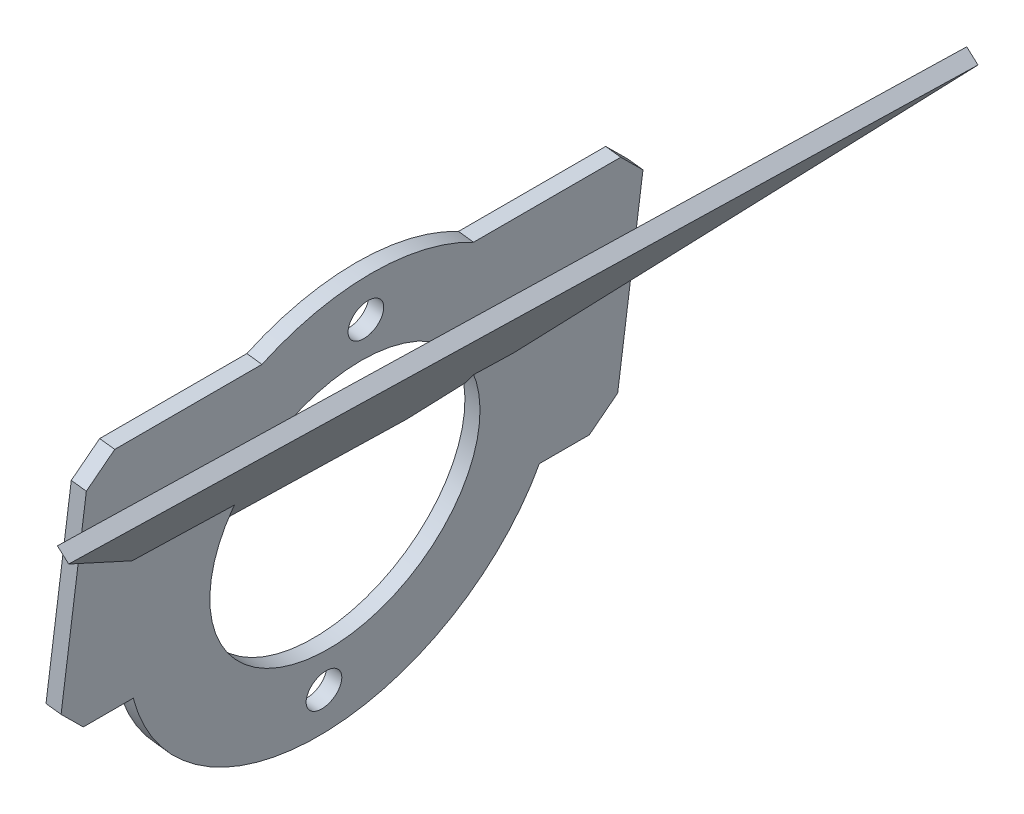
ISO-10303-21;
HEADER;
FILE_DESCRIPTION(('STEP AP214'),'2;1');
FILE_NAME('part.step','',(''),(''),'','','');
FILE_SCHEMA(('AUTOMOTIVE_DESIGN { 1 0 10303 214 1 1 1 1 }'));
ENDSEC;
DATA;
#1=APPLICATION_CONTEXT('core data for automotive mechanical design processes');
#2=APPLICATION_PROTOCOL_DEFINITION('international standard','automotive_design',2000,#1);
#3=PRODUCT_CONTEXT('',#1,'mechanical');
#4=PRODUCT('Part','Part','',(#3));
#5=PRODUCT_RELATED_PRODUCT_CATEGORY('part','',(#4));
#6=PRODUCT_DEFINITION_FORMATION('','',#4);
#7=PRODUCT_DEFINITION_CONTEXT('part definition',#1,'design');
#8=PRODUCT_DEFINITION('design','',#6,#7);
#9=PRODUCT_DEFINITION_SHAPE('','',#8);
#10=(LENGTH_UNIT() NAMED_UNIT(*) SI_UNIT(.MILLI.,.METRE.));
#11=(NAMED_UNIT(*) PLANE_ANGLE_UNIT() SI_UNIT($,.RADIAN.));
#12=(NAMED_UNIT(*) SI_UNIT($,.STERADIAN.) SOLID_ANGLE_UNIT());
#13=UNCERTAINTY_MEASURE_WITH_UNIT(LENGTH_MEASURE(1.E-05),#10,'distance_accuracy_value','');
#14=(GEOMETRIC_REPRESENTATION_CONTEXT(3) GLOBAL_UNCERTAINTY_ASSIGNED_CONTEXT((#13)) GLOBAL_UNIT_ASSIGNED_CONTEXT((#10,
#11,#12)) REPRESENTATION_CONTEXT('',''));
#15=CARTESIAN_POINT('',(0.,0.,0.));
#16=DIRECTION('',(0.,0.,1.));
#17=DIRECTION('',(1.,0.,0.));
#18=AXIS2_PLACEMENT_3D('',#15,#16,#17);
#19=CARTESIAN_POINT('',(670.929633945827,561.816555481124,-2.98207674110864E-13));
#20=DIRECTION('',(0.992546151641322,-0.121869343405148,0.));
#21=DIRECTION('',(0.121869343405148,0.992546151641322,0.));
#22=AXIS2_PLACEMENT_3D('',#19,#20,#21);
#23=PLANE('',#22);
#24=CARTESIAN_POINT('',(675.073191406301,595.563122883444,4.60794176204719E-13));
#25=DIRECTION('',(0.992546151641322,-0.121869343405148,0.));
#26=DIRECTION('',(0.121869343405148,0.992546151641322,0.));
#27=AXIS2_PLACEMENT_3D('',#24,#25,#26);
#28=CIRCLE('',#27,3.5);
#29=CARTESIAN_POINT('',(675.499734108219,599.037034414189,4.60794176204719E-13));
#30=VERTEX_POINT('',#29);
#31=EDGE_CURVE('E296',#30,#30,#28,.T.);
#32=ORIENTED_EDGE('',*,*,#31,.F.);
#33=EDGE_LOOP('',(#32));
#34=FACE_BOUND('',#33,.T.);
#35=CARTESIAN_POINT('',(670.929633945827,561.816555481124,-2.98207674110864E-13));
#36=DIRECTION('',(0.992546151641322,-0.121869343405148,0.));
#37=DIRECTION('',(0.121869343405148,0.992546151641322,0.));
#38=AXIS2_PLACEMENT_3D('',#35,#36,#37);
#39=CIRCLE('',#38,42.5);
#40=CARTESIAN_POINT('',(669.223463138155,547.920909358147,40.127920454467));
#41=VERTEX_POINT('',#40);
#42=CARTESIAN_POINT('',(669.223463138155,547.920909358147,-40.1279204544676));
#43=VERTEX_POINT('',#42);
#44=EDGE_CURVE('E214',#41,#43,#39,.T.);
#45=ORIENTED_EDGE('',*,*,#44,.T.);
#46=DIRECTION('',(-9.68280553463704E-09,-7.88601646835019E-08,-0.999999999999997));
#47=VECTOR('',#46,1.);
#48=CARTESIAN_POINT('',(669.223463138155,547.920909358147,-40.1279204544676));
#49=LINE('',#48,#47);
#50=CARTESIAN_POINT('',(669.223463042566,547.920908579634,-49.9999998763014));
#51=VERTEX_POINT('',#50);
#52=EDGE_CURVE('E124',#43,#51,#49,.T.);
#53=ORIENTED_EDGE('',*,*,#52,.T.);
#54=DIRECTION('',(0.0861746391405323,0.701836114466196,-0.707106781186542));
#55=VECTOR('',#54,1.);
#56=CARTESIAN_POINT('',(669.223463042566,547.920908579634,-49.9999998763014));
#57=LINE('',#56,#55);
#58=CARTESIAN_POINT('',(669.832809759591,552.883639337839,-54.9999998763003));
#59=VERTEX_POINT('',#58);
#60=EDGE_CURVE('E250',#51,#59,#57,.T.);
#61=ORIENTED_EDGE('',*,*,#60,.T.);
#62=DIRECTION('',(0.121869343405147,0.992546151641322,0.));
#63=VECTOR('',#62,1.);
#64=CARTESIAN_POINT('',(669.832809759591,552.883639337839,-54.9999998763003));
#65=LINE('',#64,#63);
#66=CARTESIAN_POINT('',(674.829452839203,593.578031555134,-54.9999998763003));
#67=VERTEX_POINT('',#66);
#68=EDGE_CURVE('E269',#59,#67,#65,.T.);
#69=ORIENTED_EDGE('',*,*,#68,.T.);
#70=DIRECTION('',(0.0861746391405155,0.701836114465991,0.707106781186747));
#71=VECTOR('',#70,1.);
#72=CARTESIAN_POINT('',(674.829452839203,593.578031555134,-54.9999998763003));
#73=LINE('',#72,#71);
#74=CARTESIAN_POINT('',(675.438799556228,598.540762313341,-49.9999998762971));
#75=VERTEX_POINT('',#74);
#76=EDGE_CURVE('E266',#67,#75,#73,.T.);
#77=ORIENTED_EDGE('',*,*,#76,.T.);
#78=DIRECTION('',(0.,0.,1.));
#79=VECTOR('',#78,1.);
#80=CARTESIAN_POINT('',(675.438799556228,598.540762313341,-49.9999998762971));
#81=LINE('',#80,#79);
#82=CARTESIAN_POINT('',(675.438799556228,598.540762313341,-20.9105236663259));
#83=VERTEX_POINT('',#82);
#84=EDGE_CURVE('E268',#75,#83,#81,.T.);
#85=ORIENTED_EDGE('',*,*,#84,.T.);
#86=CARTESIAN_POINT('',(670.929633850238,561.816554702612,-2.93946994287904E-13));
#87=DIRECTION('',(0.992546151641322,-0.121869343405148,0.));
#88=DIRECTION('',(0.121869343405148,0.992546151641322,0.));
#89=AXIS2_PLACEMENT_3D('',#86,#87,#88);
#90=CIRCLE('',#89,42.4999999999999);
#91=CARTESIAN_POINT('',(675.438799556228,598.540762313341,20.910523666327));
#92=VERTEX_POINT('',#91);
#93=EDGE_CURVE('E273',#83,#92,#90,.T.);
#94=ORIENTED_EDGE('',*,*,#93,.T.);
#95=DIRECTION('',(0.,0.,1.));
#96=VECTOR('',#95,1.);
#97=CARTESIAN_POINT('',(675.438799556228,598.540762313341,20.9105236663272));
#98=LINE('',#97,#96);
#99=CARTESIAN_POINT('',(675.438799556228,598.540762313341,49.9999999999997));
#100=VERTEX_POINT('',#99);
#101=EDGE_CURVE('E280',#92,#100,#98,.T.);
#102=ORIENTED_EDGE('',*,*,#101,.T.);
#103=DIRECTION('',(-0.0861746391405062,-0.701836114465997,0.707106781186742));
#104=VECTOR('',#103,1.);
#105=CARTESIAN_POINT('',(675.438799556228,598.540762313341,49.9999999999997));
#106=LINE('',#105,#104);
#107=CARTESIAN_POINT('',(674.829452839203,593.578031555134,55.0000000000024));
#108=VERTEX_POINT('',#107);
#109=EDGE_CURVE('E155',#100,#108,#106,.T.);
#110=ORIENTED_EDGE('',*,*,#109,.T.);
#111=DIRECTION('',(-0.121869343405146,-0.992546151641322,0.));
#112=VECTOR('',#111,1.);
#113=CARTESIAN_POINT('',(674.829452839203,593.578031555134,55.0000000000024));
#114=LINE('',#113,#112);
#115=CARTESIAN_POINT('',(669.832809759591,552.883639337838,55.0000000000038));
#116=VERTEX_POINT('',#115);
#117=EDGE_CURVE('E149',#108,#116,#114,.T.);
#118=ORIENTED_EDGE('',*,*,#117,.T.);
#119=DIRECTION('',(-0.0861746391405168,-0.701836114466056,-0.707106781186682));
#120=VECTOR('',#119,1.);
#121=CARTESIAN_POINT('',(669.832809759591,552.883639337838,55.0000000000038));
#122=LINE('',#121,#120);
#123=CARTESIAN_POINT('',(669.223463042566,547.920908579634,50.0000000000039));
#124=VERTEX_POINT('',#123);
#125=EDGE_CURVE('E153',#116,#124,#122,.T.);
#126=ORIENTED_EDGE('',*,*,#125,.T.);
#127=DIRECTION('',(9.68280541330565E-09,7.88601636953365E-08,-0.999999999999997));
#128=VECTOR('',#127,1.);
#129=CARTESIAN_POINT('',(669.223463042566,547.920908579634,50.0000000000039));
#130=LINE('',#129,#128);
#131=EDGE_CURVE('E69',#124,#41,#130,.T.);
#132=ORIENTED_EDGE('',*,*,#131,.T.);
#133=EDGE_LOOP('',(#45,#53,#61,#69,#77,#85,#94,#102,#110,#118,#126,#132));
#134=FACE_BOUND('',#133,.T.);
#135=CARTESIAN_POINT('',(666.786076399814,528.069987382141,-6.72139195005827E-13));
#136=DIRECTION('',(0.992546151641322,-0.121869343405148,0.));
#137=DIRECTION('',(0.121869343405148,0.992546151641322,0.));
#138=AXIS2_PLACEMENT_3D('',#135,#136,#137);
#139=CIRCLE('',#138,3.50000000000001);
#140=CARTESIAN_POINT('',(667.212619101731,531.543898912886,-6.72139195005827E-13));
#141=VERTEX_POINT('',#140);
#142=EDGE_CURVE('E184',#141,#141,#139,.T.);
#143=ORIENTED_EDGE('',*,*,#142,.F.);
#144=EDGE_LOOP('',(#143));
#145=FACE_BOUND('',#144,.T.);
#146=CARTESIAN_POINT('',(670.929633850238,561.816554702612,-2.93946994287904E-13));
#147=DIRECTION('',(0.992546151641322,-0.121869343405148,0.));
#148=DIRECTION('',(0.121869343405148,0.992546151641322,0.));
#149=AXIS2_PLACEMENT_3D('',#146,#147,#148);
#150=CIRCLE('',#149,26.5);
#151=CARTESIAN_POINT('',(674.159171450474,588.119027721107,-2.93946994287904E-13));
#152=VERTEX_POINT('',#151);
#153=EDGE_CURVE('E291',#152,#152,#150,.T.);
#154=ORIENTED_EDGE('',*,*,#153,.F.);
#155=EDGE_LOOP('',(#154));
#156=FACE_BOUND('',#155,.T.);
#157=ADVANCED_FACE('F51',(#34,#134,#145,#156),#23,.T.);
#158=CARTESIAN_POINT('',(667.951995490903,562.182163511339,-2.97973318314905E-13));
#159=DIRECTION('',(0.992546151641322,-0.121869343405148,0.));
#160=DIRECTION('',(0.121869343405148,0.992546151641322,0.));
#161=AXIS2_PLACEMENT_3D('',#158,#159,#160);
#162=PLANE('',#161);
#163=CARTESIAN_POINT('',(667.951995490903,562.182163511339,-2.97973318314905E-13));
#164=DIRECTION('',(0.992546151641322,-0.121869343405148,0.));
#165=DIRECTION('',(0.121869343405148,0.992546151641322,0.));
#166=AXIS2_PLACEMENT_3D('',#163,#164,#165);
#167=CIRCLE('',#166,42.5);
#168=CARTESIAN_POINT('',(666.245824683231,548.286517388363,40.127920454467));
#169=VERTEX_POINT('',#168);
#170=CARTESIAN_POINT('',(666.245824683231,548.286517388363,-40.1279204544676));
#171=VERTEX_POINT('',#170);
#172=EDGE_CURVE('E179',#169,#171,#167,.T.);
#173=ORIENTED_EDGE('',*,*,#172,.F.);
#174=DIRECTION('',(9.68280541330565E-09,7.88601636953365E-08,-0.999999999999997));
#175=VECTOR('',#174,1.);
#176=CARTESIAN_POINT('',(666.245824587642,548.286516609849,50.0000000000039));
#177=LINE('',#176,#175);
#178=CARTESIAN_POINT('',(666.245824587642,548.286516609849,50.0000000000039));
#179=VERTEX_POINT('',#178);
#180=EDGE_CURVE('E116',#179,#169,#177,.T.);
#181=ORIENTED_EDGE('',*,*,#180,.F.);
#182=DIRECTION('',(-0.0861746391405168,-0.701836114466056,-0.707106781186682));
#183=VECTOR('',#182,1.);
#184=CARTESIAN_POINT('',(666.855171304667,553.249247368054,55.0000000000038));
#185=LINE('',#184,#183);
#186=CARTESIAN_POINT('',(666.855171304667,553.249247368054,55.0000000000038));
#187=VERTEX_POINT('',#186);
#188=EDGE_CURVE('E110',#187,#179,#185,.T.);
#189=ORIENTED_EDGE('',*,*,#188,.F.);
#190=DIRECTION('',(-0.121869343405146,-0.992546151641322,0.));
#191=VECTOR('',#190,1.);
#192=CARTESIAN_POINT('',(671.851814384279,593.94363958535,55.0000000000024));
#193=LINE('',#192,#191);
#194=CARTESIAN_POINT('',(671.851814384279,593.94363958535,55.0000000000024));
#195=VERTEX_POINT('',#194);
#196=EDGE_CURVE('E164',#195,#187,#193,.T.);
#197=ORIENTED_EDGE('',*,*,#196,.F.);
#198=DIRECTION('',(-0.0861746391405062,-0.701836114465997,0.707106781186742));
#199=VECTOR('',#198,1.);
#200=CARTESIAN_POINT('',(672.461161101304,598.906370343556,49.9999999999997));
#201=LINE('',#200,#199);
#202=CARTESIAN_POINT('',(672.461161101304,598.906370343556,49.9999999999997));
#203=VERTEX_POINT('',#202);
#204=EDGE_CURVE('E205',#203,#195,#201,.T.);
#205=ORIENTED_EDGE('',*,*,#204,.F.);
#206=DIRECTION('',(0.,0.,1.));
#207=VECTOR('',#206,1.);
#208=CARTESIAN_POINT('',(672.461161101304,598.906370343557,20.9105236663272));
#209=LINE('',#208,#207);
#210=CARTESIAN_POINT('',(672.461161101304,598.906370343556,20.910523666327));
#211=VERTEX_POINT('',#210);
#212=EDGE_CURVE('E202',#211,#203,#209,.T.);
#213=ORIENTED_EDGE('',*,*,#212,.F.);
#214=CARTESIAN_POINT('',(667.951995395314,562.182162732828,-2.93712638491945E-13));
#215=DIRECTION('',(0.992546151641322,-0.121869343405148,0.));
#216=DIRECTION('',(0.121869343405148,0.992546151641322,0.));
#217=AXIS2_PLACEMENT_3D('',#214,#215,#216);
#218=CIRCLE('',#217,42.4999999999999);
#219=CARTESIAN_POINT('',(672.461161101304,598.906370343557,-20.9105236663259));
#220=VERTEX_POINT('',#219);
#221=EDGE_CURVE('E199',#220,#211,#218,.T.);
#222=ORIENTED_EDGE('',*,*,#221,.F.);
#223=DIRECTION('',(0.,0.,1.));
#224=VECTOR('',#223,1.);
#225=CARTESIAN_POINT('',(672.461161101304,598.906370343557,-49.9999998762971));
#226=LINE('',#225,#224);
#227=CARTESIAN_POINT('',(672.461161101304,598.906370343557,-49.9999998762971));
#228=VERTEX_POINT('',#227);
#229=EDGE_CURVE('E196',#228,#220,#226,.T.);
#230=ORIENTED_EDGE('',*,*,#229,.F.);
#231=DIRECTION('',(0.0861746391405155,0.701836114465991,0.707106781186747));
#232=VECTOR('',#231,1.);
#233=CARTESIAN_POINT('',(671.851814384279,593.94363958535,-54.9999998763003));
#234=LINE('',#233,#232);
#235=CARTESIAN_POINT('',(671.851814384279,593.94363958535,-54.9999998763003));
#236=VERTEX_POINT('',#235);
#237=EDGE_CURVE('E193',#236,#228,#234,.T.);
#238=ORIENTED_EDGE('',*,*,#237,.F.);
#239=DIRECTION('',(0.121869343405147,0.992546151641322,0.));
#240=VECTOR('',#239,1.);
#241=CARTESIAN_POINT('',(666.855171304667,553.249247368055,-54.9999998763003));
#242=LINE('',#241,#240);
#243=CARTESIAN_POINT('',(666.855171304667,553.249247368055,-54.9999998763003));
#244=VERTEX_POINT('',#243);
#245=EDGE_CURVE('E190',#244,#236,#242,.T.);
#246=ORIENTED_EDGE('',*,*,#245,.F.);
#247=DIRECTION('',(0.0861746391405323,0.701836114466196,-0.707106781186542));
#248=VECTOR('',#247,1.);
#249=CARTESIAN_POINT('',(666.245824587642,548.286516609849,-49.9999998763014));
#250=LINE('',#249,#248);
#251=CARTESIAN_POINT('',(666.245824587642,548.286516609849,-49.9999998763014));
#252=VERTEX_POINT('',#251);
#253=EDGE_CURVE('E187',#252,#244,#250,.T.);
#254=ORIENTED_EDGE('',*,*,#253,.F.);
#255=DIRECTION('',(-9.68280553463704E-09,-7.88601646835019E-08,-0.999999999999997));
#256=VECTOR('',#255,1.);
#257=CARTESIAN_POINT('',(666.245824683231,548.286517388363,-40.1279204544676));
#258=LINE('',#257,#256);
#259=EDGE_CURVE('E183',#171,#252,#258,.T.);
#260=ORIENTED_EDGE('',*,*,#259,.F.);
#261=EDGE_LOOP('',(#173,#181,#189,#197,#205,#213,#222,#230,#238,#246,#254,#260));
#262=FACE_BOUND('',#261,.T.);
#263=CARTESIAN_POINT('',(663.80843794489,528.435595412357,-6.71904839209868E-13));
#264=DIRECTION('',(0.992546151641322,-0.121869343405148,0.));
#265=DIRECTION('',(0.121869343405148,0.992546151641322,0.));
#266=AXIS2_PLACEMENT_3D('',#263,#264,#265);
#267=CIRCLE('',#266,3.50000000000001);
#268=CARTESIAN_POINT('',(664.234980646808,531.909506943102,-6.71904839209868E-13));
#269=VERTEX_POINT('',#268);
#270=EDGE_CURVE('E293',#269,#269,#267,.T.);
#271=ORIENTED_EDGE('',*,*,#270,.T.);
#272=EDGE_LOOP('',(#271));
#273=FACE_BOUND('',#272,.T.);
#274=CARTESIAN_POINT('',(672.095552951377,595.928730913659,4.61028532000678E-13));
#275=DIRECTION('',(0.992546151641322,-0.121869343405148,0.));
#276=DIRECTION('',(0.121869343405148,0.992546151641322,0.));
#277=AXIS2_PLACEMENT_3D('',#274,#275,#276);
#278=CIRCLE('',#277,3.5);
#279=CARTESIAN_POINT('',(672.522095653295,599.402642444404,4.61028532000678E-13));
#280=VERTEX_POINT('',#279);
#281=EDGE_CURVE('E285',#280,#280,#278,.T.);
#282=ORIENTED_EDGE('',*,*,#281,.T.);
#283=EDGE_LOOP('',(#282));
#284=FACE_BOUND('',#283,.T.);
#285=CARTESIAN_POINT('',(667.951995395314,562.182162732828,-2.93712638491945E-13));
#286=DIRECTION('',(0.992546151641322,-0.121869343405148,0.));
#287=DIRECTION('',(0.121869343405148,0.992546151641322,0.));
#288=AXIS2_PLACEMENT_3D('',#285,#286,#287);
#289=CIRCLE('',#288,26.5);
#290=CARTESIAN_POINT('',(671.18153299555,588.484635751323,-2.93712638491945E-13));
#291=VERTEX_POINT('',#290);
#292=EDGE_CURVE('E288',#291,#291,#289,.T.);
#293=ORIENTED_EDGE('',*,*,#292,.T.);
#294=EDGE_LOOP('',(#293));
#295=FACE_BOUND('',#294,.T.);
#296=ADVANCED_FACE('F254',(#262,#273,#284,#295),#162,.F.);
#297=CARTESIAN_POINT('',(670.929633945827,561.816555481124,-2.98207674110864E-13));
#298=DIRECTION('',(-0.992546151641322,0.121869343405148,0.));
#299=DIRECTION('',(-0.121869343405148,-0.992546151641322,0.));
#300=AXIS2_PLACEMENT_3D('',#297,#298,#299);
#301=CYLINDRICAL_SURFACE('',#300,42.5);
#302=ORIENTED_EDGE('',*,*,#172,.T.);
#303=DIRECTION('',(-0.992546151641322,0.121869343405148,0.));
#304=VECTOR('',#303,1.);
#305=CARTESIAN_POINT('',(669.223463138155,547.920909358147,-40.1279204544676));
#306=LINE('',#305,#304);
#307=EDGE_CURVE('E12',#43,#171,#306,.T.);
#308=ORIENTED_EDGE('',*,*,#307,.F.);
#309=ORIENTED_EDGE('',*,*,#44,.F.);
#310=DIRECTION('',(-0.992546151641322,0.121869343405148,0.));
#311=VECTOR('',#310,1.);
#312=CARTESIAN_POINT('',(669.223463138155,547.920909358147,40.127920454467));
#313=LINE('',#312,#311);
#314=EDGE_CURVE('E175',#41,#169,#313,.T.);
#315=ORIENTED_EDGE('',*,*,#314,.T.);
#316=EDGE_LOOP('',(#302,#308,#309,#315));
#317=FACE_BOUND('',#316,.T.);
#318=ADVANCED_FACE('F53',(#317),#301,.T.);
#319=CARTESIAN_POINT('',(669.223463138155,547.920909358147,-40.1279204544676));
#320=DIRECTION('',(0.121869343405147,0.992546151641319,-7.94523901272367E-08));
#321=DIRECTION('',(-0.992546151641322,0.121869343405148,0.));
#322=AXIS2_PLACEMENT_3D('',#319,#320,#321);
#323=PLANE('',#322);
#324=ORIENTED_EDGE('',*,*,#259,.T.);
#325=DIRECTION('',(-0.992546151641322,0.121869343405148,0.));
#326=VECTOR('',#325,1.);
#327=CARTESIAN_POINT('',(669.223463042566,547.920908579634,-49.9999998763014));
#328=LINE('',#327,#326);
#329=EDGE_CURVE('E61',#51,#252,#328,.T.);
#330=ORIENTED_EDGE('',*,*,#329,.F.);
#331=ORIENTED_EDGE('',*,*,#52,.F.);
#332=ORIENTED_EDGE('',*,*,#307,.T.);
#333=EDGE_LOOP('',(#324,#330,#331,#332));
#334=FACE_BOUND('',#333,.T.);
#335=ADVANCED_FACE('F316',(#334),#323,.F.);
#336=CARTESIAN_POINT('',(669.223463042566,547.920908579634,-49.9999998763014));
#337=DIRECTION('',(0.0861746391405314,0.701836114466185,0.707106781186553));
#338=DIRECTION('',(0.,-0.709747006865429,0.704456660303218));
#339=AXIS2_PLACEMENT_3D('',#336,#337,#338);
#340=PLANE('',#339);
#341=ORIENTED_EDGE('',*,*,#253,.T.);
#342=DIRECTION('',(-0.992546151641322,0.121869343405148,0.));
#343=VECTOR('',#342,1.);
#344=CARTESIAN_POINT('',(669.832809759591,552.883639337839,-54.9999998763003));
#345=LINE('',#344,#343);
#346=EDGE_CURVE('E240',#59,#244,#345,.T.);
#347=ORIENTED_EDGE('',*,*,#346,.F.);
#348=ORIENTED_EDGE('',*,*,#60,.F.);
#349=ORIENTED_EDGE('',*,*,#329,.T.);
#350=EDGE_LOOP('',(#341,#347,#348,#349));
#351=FACE_BOUND('',#350,.T.);
#352=ADVANCED_FACE('F248',(#351),#340,.F.);
#353=CARTESIAN_POINT('',(669.832809759591,552.883639337839,-54.9999998763003));
#354=DIRECTION('',(0.,0.,1.));
#355=DIRECTION('',(0.,-1.,0.));
#356=AXIS2_PLACEMENT_3D('',#353,#354,#355);
#357=PLANE('',#356);
#358=ORIENTED_EDGE('',*,*,#245,.T.);
#359=DIRECTION('',(-0.992546151641322,0.121869343405148,0.));
#360=VECTOR('',#359,1.);
#361=CARTESIAN_POINT('',(674.829452839203,593.578031555134,-54.9999998763003));
#362=LINE('',#361,#360);
#363=EDGE_CURVE('E236',#67,#236,#362,.T.);
#364=ORIENTED_EDGE('',*,*,#363,.F.);
#365=ORIENTED_EDGE('',*,*,#68,.F.);
#366=ORIENTED_EDGE('',*,*,#346,.T.);
#367=EDGE_LOOP('',(#358,#364,#365,#366));
#368=FACE_BOUND('',#367,.T.);
#369=ADVANCED_FACE('F260',(#368),#357,.F.);
#370=CARTESIAN_POINT('',(674.829452839203,593.578031555134,-54.9999998763003));
#371=DIRECTION('',(-0.0861746391405562,-0.701836114466388,0.707106781186349));
#372=DIRECTION('',(0.,-0.709747006865226,-0.704456660303423));
#373=AXIS2_PLACEMENT_3D('',#370,#371,#372);
#374=PLANE('',#373);
#375=ORIENTED_EDGE('',*,*,#237,.T.);
#376=DIRECTION('',(-0.992546151641322,0.121869343405148,0.));
#377=VECTOR('',#376,1.);
#378=CARTESIAN_POINT('',(675.438799556228,598.540762313341,-49.9999998762971));
#379=LINE('',#378,#377);
#380=EDGE_CURVE('E232',#75,#228,#379,.T.);
#381=ORIENTED_EDGE('',*,*,#380,.F.);
#382=ORIENTED_EDGE('',*,*,#76,.F.);
#383=ORIENTED_EDGE('',*,*,#363,.T.);
#384=EDGE_LOOP('',(#375,#381,#382,#383));
#385=FACE_BOUND('',#384,.T.);
#386=ADVANCED_FACE('F264',(#385),#374,.F.);
#387=CARTESIAN_POINT('',(675.438799556228,598.540762313341,-49.9999998762971));
#388=DIRECTION('',(-0.121869343405148,-0.992546151641322,0.));
#389=DIRECTION('',(0.992546151641322,-0.121869343405148,0.));
#390=AXIS2_PLACEMENT_3D('',#387,#388,#389);
#391=PLANE('',#390);
#392=ORIENTED_EDGE('',*,*,#229,.T.);
#393=DIRECTION('',(-0.992546151641322,0.121869343405148,0.));
#394=VECTOR('',#393,1.);
#395=CARTESIAN_POINT('',(675.438799556228,598.540762313341,-20.9105236663259));
#396=LINE('',#395,#394);
#397=EDGE_CURVE('E228',#83,#220,#396,.T.);
#398=ORIENTED_EDGE('',*,*,#397,.F.);
#399=ORIENTED_EDGE('',*,*,#84,.F.);
#400=ORIENTED_EDGE('',*,*,#380,.T.);
#401=EDGE_LOOP('',(#392,#398,#399,#400));
#402=FACE_BOUND('',#401,.T.);
#403=ADVANCED_FACE('F353',(#402),#391,.F.);
#404=CARTESIAN_POINT('',(670.929633850238,561.816554702612,-2.93946994287904E-13));
#405=DIRECTION('',(-0.992546151641322,0.121869343405148,0.));
#406=DIRECTION('',(-0.121869343405148,-0.992546151641322,0.));
#407=AXIS2_PLACEMENT_3D('',#404,#405,#406);
#408=CYLINDRICAL_SURFACE('',#407,42.4999999999999);
#409=ORIENTED_EDGE('',*,*,#221,.T.);
#410=DIRECTION('',(-0.992546151641322,0.121869343405148,0.));
#411=VECTOR('',#410,1.);
#412=CARTESIAN_POINT('',(675.438799556228,598.540762313341,20.910523666327));
#413=LINE('',#412,#411);
#414=EDGE_CURVE('E225',#92,#211,#413,.T.);
#415=ORIENTED_EDGE('',*,*,#414,.F.);
#416=ORIENTED_EDGE('',*,*,#93,.F.);
#417=ORIENTED_EDGE('',*,*,#397,.T.);
#418=EDGE_LOOP('',(#409,#415,#416,#417));
#419=FACE_BOUND('',#418,.T.);
#420=ADVANCED_FACE('F349',(#419),#408,.T.);
#421=CARTESIAN_POINT('',(675.438799556228,598.540762313341,20.9105236663272));
#422=DIRECTION('',(-0.121869343405148,-0.992546151641322,0.));
#423=DIRECTION('',(0.992546151641322,-0.121869343405148,0.));
#424=AXIS2_PLACEMENT_3D('',#421,#422,#423);
#425=PLANE('',#424);
#426=ORIENTED_EDGE('',*,*,#212,.T.);
#427=DIRECTION('',(-0.992546151641322,0.121869343405148,0.));
#428=VECTOR('',#427,1.);
#429=CARTESIAN_POINT('',(675.438799556228,598.540762313341,49.9999999999997));
#430=LINE('',#429,#428);
#431=EDGE_CURVE('E221',#100,#203,#430,.T.);
#432=ORIENTED_EDGE('',*,*,#431,.F.);
#433=ORIENTED_EDGE('',*,*,#101,.F.);
#434=ORIENTED_EDGE('',*,*,#414,.T.);
#435=EDGE_LOOP('',(#426,#432,#433,#434));
#436=FACE_BOUND('',#435,.T.);
#437=ADVANCED_FACE('F345',(#436),#425,.F.);
#438=CARTESIAN_POINT('',(675.438799556228,598.540762313341,49.9999999999997));
#439=DIRECTION('',(-0.0861746391405559,-0.701836114466383,-0.707106781186353));
#440=DIRECTION('',(0.,0.70974700686523,-0.704456660303419));
#441=AXIS2_PLACEMENT_3D('',#438,#439,#440);
#442=PLANE('',#441);
#443=ORIENTED_EDGE('',*,*,#204,.T.);
#444=DIRECTION('',(-0.992546151641322,0.121869343405148,0.));
#445=VECTOR('',#444,1.);
#446=CARTESIAN_POINT('',(674.829452839203,593.578031555134,55.0000000000024));
#447=LINE('',#446,#445);
#448=EDGE_CURVE('E166',#108,#195,#447,.T.);
#449=ORIENTED_EDGE('',*,*,#448,.F.);
#450=ORIENTED_EDGE('',*,*,#109,.F.);
#451=ORIENTED_EDGE('',*,*,#431,.T.);
#452=EDGE_LOOP('',(#443,#449,#450,#451));
#453=FACE_BOUND('',#452,.T.);
#454=ADVANCED_FACE('F342',(#453),#442,.F.);
#455=CARTESIAN_POINT('',(674.829452839203,593.578031555134,55.0000000000024));
#456=DIRECTION('',(0.,0.,-1.));
#457=DIRECTION('',(0.,1.,0.));
#458=AXIS2_PLACEMENT_3D('',#455,#456,#457);
#459=PLANE('',#458);
#460=ORIENTED_EDGE('',*,*,#196,.T.);
#461=DIRECTION('',(-0.992546151641322,0.121869343405148,0.));
#462=VECTOR('',#461,1.);
#463=CARTESIAN_POINT('',(669.832809759591,552.883639337838,55.0000000000038));
#464=LINE('',#463,#462);
#465=EDGE_CURVE('E161',#116,#187,#464,.T.);
#466=ORIENTED_EDGE('',*,*,#465,.F.);
#467=ORIENTED_EDGE('',*,*,#117,.F.);
#468=ORIENTED_EDGE('',*,*,#448,.T.);
#469=EDGE_LOOP('',(#460,#466,#467,#468));
#470=FACE_BOUND('',#469,.T.);
#471=ADVANCED_FACE('F162',(#470),#459,.F.);
#472=CARTESIAN_POINT('',(669.832809759591,552.883639337838,55.0000000000038));
#473=DIRECTION('',(0.0861746391405484,0.701836114466324,-0.707106781186413));
#474=DIRECTION('',(0.,0.70974700686529,0.704456660303359));
#475=AXIS2_PLACEMENT_3D('',#472,#473,#474);
#476=PLANE('',#475);
#477=ORIENTED_EDGE('',*,*,#188,.T.);
#478=DIRECTION('',(-0.992546151641322,0.121869343405148,0.));
#479=VECTOR('',#478,1.);
#480=CARTESIAN_POINT('',(669.223463042566,547.920908579634,50.0000000000039));
#481=LINE('',#480,#479);
#482=EDGE_CURVE('E167',#124,#179,#481,.T.);
#483=ORIENTED_EDGE('',*,*,#482,.F.);
#484=ORIENTED_EDGE('',*,*,#125,.F.);
#485=ORIENTED_EDGE('',*,*,#465,.T.);
#486=EDGE_LOOP('',(#477,#483,#484,#485));
#487=FACE_BOUND('',#486,.T.);
#488=ADVANCED_FACE('F169',(#487),#476,.F.);
#489=CARTESIAN_POINT('',(669.223463042566,547.920908579634,50.0000000000039));
#490=DIRECTION('',(0.121869343405147,0.992546151641319,7.94523891316503E-08));
#491=DIRECTION('',(-0.992546151641322,0.121869343405148,0.));
#492=AXIS2_PLACEMENT_3D('',#489,#490,#491);
#493=PLANE('',#492);
#494=ORIENTED_EDGE('',*,*,#180,.T.);
#495=ORIENTED_EDGE('',*,*,#314,.F.);
#496=ORIENTED_EDGE('',*,*,#131,.F.);
#497=ORIENTED_EDGE('',*,*,#482,.T.);
#498=EDGE_LOOP('',(#494,#495,#496,#497));
#499=FACE_BOUND('',#498,.T.);
#500=ADVANCED_FACE('F335',(#499),#493,.F.);
#501=CARTESIAN_POINT('',(666.786076399814,528.069987382141,-6.72139195005827E-13));
#502=DIRECTION('',(-0.992546151641322,0.121869343405148,0.));
#503=DIRECTION('',(-0.121869343405148,-0.992546151641322,0.));
#504=AXIS2_PLACEMENT_3D('',#501,#502,#503);
#505=CYLINDRICAL_SURFACE('',#504,3.50000000000001);
#506=ORIENTED_EDGE('',*,*,#142,.T.);
#507=EDGE_LOOP('',(#506));
#508=FACE_BOUND('',#507,.T.);
#509=ORIENTED_EDGE('',*,*,#270,.F.);
#510=EDGE_LOOP('',(#509));
#511=FACE_BOUND('',#510,.T.);
#512=ADVANCED_FACE('F332',(#508,#511),#505,.F.);
#513=CARTESIAN_POINT('',(675.073191406301,595.563122883444,4.60794176204719E-13));
#514=DIRECTION('',(-0.992546151641322,0.121869343405148,0.));
#515=DIRECTION('',(-0.121869343405148,-0.992546151641322,0.));
#516=AXIS2_PLACEMENT_3D('',#513,#514,#515);
#517=CYLINDRICAL_SURFACE('',#516,3.5);
#518=ORIENTED_EDGE('',*,*,#31,.T.);
#519=EDGE_LOOP('',(#518));
#520=FACE_BOUND('',#519,.T.);
#521=ORIENTED_EDGE('',*,*,#281,.F.);
#522=EDGE_LOOP('',(#521));
#523=FACE_BOUND('',#522,.T.);
#524=ADVANCED_FACE('F394',(#520,#523),#517,.F.);
#525=CARTESIAN_POINT('',(670.929633850238,561.816554702612,-2.93946994287904E-13));
#526=DIRECTION('',(-0.992546151641322,0.121869343405148,0.));
#527=DIRECTION('',(-0.121869343405148,-0.992546151641322,0.));
#528=AXIS2_PLACEMENT_3D('',#525,#526,#527);
#529=CYLINDRICAL_SURFACE('',#528,26.5);
#530=ORIENTED_EDGE('',*,*,#153,.T.);
#531=EDGE_LOOP('',(#530));
#532=FACE_BOUND('',#531,.T.);
#533=ORIENTED_EDGE('',*,*,#292,.F.);
#534=EDGE_LOOP('',(#533));
#535=FACE_BOUND('',#534,.T.);
#536=ADVANCED_FACE('F400',(#532,#535),#529,.F.);
#537=CLOSED_SHELL('',(#157,#296,#318,#335,#352,#369,#386,#403,#420,#437,#454,#471,#488,#500,
#512,#524,#536));
#538=MANIFOLD_SOLID_BREP('B2',#537);
#539=CARTESIAN_POINT('',(663.062837129028,566.713070922351,-17.8569774397097));
#540=DIRECTION('',(-0.649723731276447,-0.760170195113141,0.000589472527832829));
#541=DIRECTION('',(0.760170327184332,-0.649723844158783,0.));
#542=AXIS2_PLACEMENT_3D('',#539,#540,#541);
#543=PLANE('',#542);
#544=DIRECTION('',(0.0130831840348367,-0.0119576315071492,-0.999842910333543));
#545=VECTOR('',#544,1.);
#546=CARTESIAN_POINT('',(665.343010615806,564.764229059707,-17.8038336291482));
#547=LINE('',#546,#545);
#548=CARTESIAN_POINT('',(664.688446674257,565.362480554915,32.2192429075171));
#549=VERTEX_POINT('',#548);
#550=CARTESIAN_POINT('',(665.343010615806,564.764229059707,-17.8038336291482));
#551=VERTEX_POINT('',#550);
#552=EDGE_CURVE('E575',#549,#551,#547,.T.);
#553=ORIENTED_EDGE('',*,*,#552,.F.);
#554=DIRECTION('',(0.760057828926011,-0.649613954214647,0.0177146035205174));
#555=VECTOR('',#554,1.);
#556=CARTESIAN_POINT('',(662.408273187478,567.311322417559,32.1660990969556));
#557=LINE('',#556,#555);
#558=CARTESIAN_POINT('',(662.408273187478,567.311322417559,32.1660990969556));
#559=VERTEX_POINT('',#558);
#560=EDGE_CURVE('E49',#559,#549,#557,.T.);
#561=ORIENTED_EDGE('',*,*,#560,.F.);
#562=DIRECTION('',(0.0130831840348367,-0.0119576315071492,-0.999842910333543));
#563=VECTOR('',#562,1.);
#564=CARTESIAN_POINT('',(663.062837129028,566.713070922351,-17.8569774397097));
#565=LINE('',#564,#563);
#566=CARTESIAN_POINT('',(663.062837129028,566.713070922351,-17.8569774397097));
#567=VERTEX_POINT('',#566);
#568=EDGE_CURVE('E567',#559,#567,#565,.T.);
#569=ORIENTED_EDGE('',*,*,#568,.T.);
#570=DIRECTION('',(0.760057828926011,-0.649613954214647,0.0177146035205174));
#571=VECTOR('',#570,1.);
#572=CARTESIAN_POINT('',(663.062837129028,566.713070922351,-17.8569774397097));
#573=LINE('',#572,#571);
#574=EDGE_CURVE('E508',#567,#551,#573,.T.);
#575=ORIENTED_EDGE('',*,*,#574,.T.);
#576=EDGE_LOOP('',(#553,#561,#569,#575));
#577=FACE_BOUND('',#576,.T.);
#578=ADVANCED_FACE('F505',(#577),#543,.T.);
#579=CARTESIAN_POINT('',(662.408273187478,567.311322417559,32.1660990969556));
#580=DIRECTION('',(-0.45244176548129,-0.509402605520146,0.731987318426665));
#581=DIRECTION('',(0.,-0.820803189587262,-0.571211102801212));
#582=AXIS2_PLACEMENT_3D('',#579,#580,#581);
#583=PLANE('',#582);
#584=DIRECTION('',(-0.466485311169014,-0.564367518536367,-0.681087922727052));
#585=VECTOR('',#584,1.);
#586=CARTESIAN_POINT('',(664.688446674257,565.362480554915,32.2192429075171));
#587=LINE('',#586,#585);
#588=CARTESIAN_POINT('',(699.752921115782,607.784503189998,83.4148314653783));
#589=VERTEX_POINT('',#588);
#590=EDGE_CURVE('E571',#589,#549,#587,.T.);
#591=ORIENTED_EDGE('',*,*,#590,.F.);
#592=DIRECTION('',(0.760057828926011,-0.649613954214647,0.0177146035205174));
#593=VECTOR('',#592,1.);
#594=CARTESIAN_POINT('',(697.472747629005,609.733345052642,83.3616876548168));
#595=LINE('',#594,#593);
#596=CARTESIAN_POINT('',(697.472747629005,609.733345052642,83.3616876548168));
#597=VERTEX_POINT('',#596);
#598=EDGE_CURVE('E515',#597,#589,#595,.T.);
#599=ORIENTED_EDGE('',*,*,#598,.F.);
#600=DIRECTION('',(-0.466485311169014,-0.564367518536367,-0.681087922727052));
#601=VECTOR('',#600,1.);
#602=CARTESIAN_POINT('',(662.408273187478,567.311322417559,32.1660990969556));
#603=LINE('',#602,#601);
#604=EDGE_CURVE('E562',#597,#559,#603,.T.);
#605=ORIENTED_EDGE('',*,*,#604,.T.);
#606=ORIENTED_EDGE('',*,*,#560,.T.);
#607=EDGE_LOOP('',(#591,#599,#605,#606));
#608=FACE_BOUND('',#607,.T.);
#609=ADVANCED_FACE('F591',(#608),#583,.T.);
#610=CARTESIAN_POINT('',(697.472747629005,609.733345052642,83.3616876548168));
#611=DIRECTION('',(0.649723731276447,0.760170195113141,-0.000589472527833484));
#612=DIRECTION('',(-0.760170327184332,0.649723844158783,0.));
#613=AXIS2_PLACEMENT_3D('',#610,#611,#612);
#614=PLANE('',#613);
#615=DIRECTION('',(-0.0130831840348369,0.0119576315071502,0.999842910333543));
#616=VECTOR('',#615,1.);
#617=CARTESIAN_POINT('',(699.752921115782,607.784503189998,83.4148314653783));
#618=LINE('',#617,#616);
#619=CARTESIAN_POINT('',(702.073934366278,605.663167810266,-93.9616112353685));
#620=VERTEX_POINT('',#619);
#621=EDGE_CURVE('E556',#620,#589,#618,.T.);
#622=ORIENTED_EDGE('',*,*,#621,.F.);
#623=DIRECTION('',(0.760057828926011,-0.649613954214647,0.0177146035205174));
#624=VECTOR('',#623,1.);
#625=CARTESIAN_POINT('',(699.7937608795,607.61200967291,-94.01475504593));
#626=LINE('',#625,#624);
#627=CARTESIAN_POINT('',(699.7937608795,607.61200967291,-94.01475504593));
#628=VERTEX_POINT('',#627);
#629=EDGE_CURVE('E551',#628,#620,#626,.T.);
#630=ORIENTED_EDGE('',*,*,#629,.F.);
#631=DIRECTION('',(-0.0130831840348369,0.0119576315071502,0.999842910333543));
#632=VECTOR('',#631,1.);
#633=CARTESIAN_POINT('',(697.472747629005,609.733345052642,83.3616876548168));
#634=LINE('',#633,#632);
#635=EDGE_CURVE('E554',#628,#597,#634,.T.);
#636=ORIENTED_EDGE('',*,*,#635,.T.);
#637=ORIENTED_EDGE('',*,*,#598,.T.);
#638=EDGE_LOOP('',(#622,#630,#636,#637));
#639=FACE_BOUND('',#638,.T.);
#640=ADVANCED_FACE('F553',(#639),#614,.T.);
#641=CARTESIAN_POINT('',(699.7937608795,607.61200967291,-94.01475504593));
#642=DIRECTION('',(-0.519017161212619,-0.623210404473936,-0.585004254789849));
#643=DIRECTION('',(0.,0.684404559186991,-0.729102461499109));
#644=AXIS2_PLACEMENT_3D('',#641,#642,#643);
#645=PLANE('',#644);
#646=DIRECTION('',(0.391066852411545,0.435442880576825,-0.810836737389152));
#647=VECTOR('',#646,1.);
#648=CARTESIAN_POINT('',(702.073934366278,605.663167810266,-93.9616112353685));
#649=LINE('',#648,#647);
#650=EDGE_CURVE('E579',#551,#620,#649,.T.);
#651=ORIENTED_EDGE('',*,*,#650,.F.);
#652=ORIENTED_EDGE('',*,*,#574,.F.);
#653=DIRECTION('',(0.391066852411545,0.435442880576825,-0.810836737389152));
#654=VECTOR('',#653,1.);
#655=CARTESIAN_POINT('',(699.7937608795,607.61200967291,-94.01475504593));
#656=LINE('',#655,#654);
#657=EDGE_CURVE('E561',#567,#628,#656,.T.);
#658=ORIENTED_EDGE('',*,*,#657,.T.);
#659=ORIENTED_EDGE('',*,*,#629,.T.);
#660=EDGE_LOOP('',(#651,#652,#658,#659));
#661=FACE_BOUND('',#660,.T.);
#662=ADVANCED_FACE('F565',(#661),#645,.T.);
#663=CARTESIAN_POINT('',(102.991675819662,-88.0259728064934,2.40041827558952));
#664=DIRECTION('',(-0.760057828926011,0.649613954214647,-0.0177146035205167));
#665=DIRECTION('',(-0.649715904970779,-0.760177112802011,0.));
#666=AXIS2_PLACEMENT_3D('',#663,#664,#665);
#667=PLANE('',#666);
#668=ORIENTED_EDGE('',*,*,#568,.F.);
#669=ORIENTED_EDGE('',*,*,#604,.F.);
#670=ORIENTED_EDGE('',*,*,#635,.F.);
#671=ORIENTED_EDGE('',*,*,#657,.F.);
#672=EDGE_LOOP('',(#668,#669,#670,#671));
#673=FACE_BOUND('',#672,.T.);
#674=ADVANCED_FACE('F560',(#673),#667,.T.);
#675=CARTESIAN_POINT('',(105.27184930644,-89.9748146691373,2.45356208615107));
#676=DIRECTION('',(-0.760057828926011,0.649613954214647,-0.0177146035205167));
#677=DIRECTION('',(-0.649715904970779,-0.760177112802011,0.));
#678=AXIS2_PLACEMENT_3D('',#675,#676,#677);
#679=PLANE('',#678);
#680=ORIENTED_EDGE('',*,*,#552,.T.);
#681=ORIENTED_EDGE('',*,*,#650,.T.);
#682=ORIENTED_EDGE('',*,*,#621,.T.);
#683=ORIENTED_EDGE('',*,*,#590,.T.);
#684=EDGE_LOOP('',(#680,#681,#682,#683));
#685=FACE_BOUND('',#684,.T.);
#686=ADVANCED_FACE('F590',(#685),#679,.F.);
#687=CLOSED_SHELL('',(#578,#609,#640,#662,#674,#686));
#688=MANIFOLD_SOLID_BREP('B6_NOT_SHOWN',#687);
#689=ADVANCED_BREP_SHAPE_REPRESENTATION('',(#18,#538,#688),#14);
#690=SHAPE_DEFINITION_REPRESENTATION(#9,#689);
ENDSEC;
END-ISO-10303-21;
